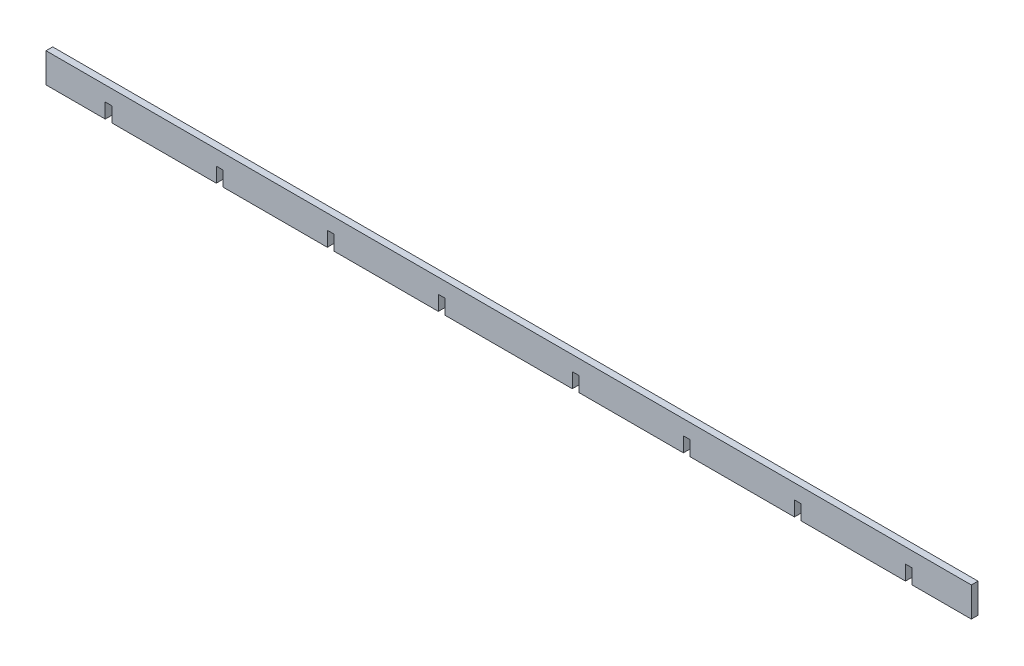
ISO-10303-21;
HEADER;
FILE_DESCRIPTION(('STEP AP214'),'2;1');
FILE_NAME('part.step','',(''),(''),'','','');
FILE_SCHEMA(('AUTOMOTIVE_DESIGN { 1 0 10303 214 1 1 1 1 }'));
ENDSEC;
DATA;
#1=APPLICATION_CONTEXT('core data for automotive mechanical design processes');
#2=APPLICATION_PROTOCOL_DEFINITION('international standard','automotive_design',2000,#1);
#3=PRODUCT_CONTEXT('',#1,'mechanical');
#4=PRODUCT('Part','Part','',(#3));
#5=PRODUCT_RELATED_PRODUCT_CATEGORY('part','',(#4));
#6=PRODUCT_DEFINITION_FORMATION('','',#4);
#7=PRODUCT_DEFINITION_CONTEXT('part definition',#1,'design');
#8=PRODUCT_DEFINITION('design','',#6,#7);
#9=PRODUCT_DEFINITION_SHAPE('','',#8);
#10=(LENGTH_UNIT() NAMED_UNIT(*) SI_UNIT(.MILLI.,.METRE.));
#11=(NAMED_UNIT(*) PLANE_ANGLE_UNIT() SI_UNIT($,.RADIAN.));
#12=(NAMED_UNIT(*) SI_UNIT($,.STERADIAN.) SOLID_ANGLE_UNIT());
#13=UNCERTAINTY_MEASURE_WITH_UNIT(LENGTH_MEASURE(1.E-05),#10,'distance_accuracy_value','');
#14=(GEOMETRIC_REPRESENTATION_CONTEXT(3) GLOBAL_UNCERTAINTY_ASSIGNED_CONTEXT((#13)) GLOBAL_UNIT_ASSIGNED_CONTEXT((#10,
#11,#12)) REPRESENTATION_CONTEXT('',''));
#15=CARTESIAN_POINT('',(0.,0.,0.));
#16=DIRECTION('',(0.,0.,1.));
#17=DIRECTION('',(1.,0.,0.));
#18=AXIS2_PLACEMENT_3D('',#15,#16,#17);
#19=CARTESIAN_POINT('',(2162.,0.,18.));
#20=DIRECTION('',(-1.,0.,0.));
#21=DIRECTION('',(0.,0.,1.));
#22=AXIS2_PLACEMENT_3D('',#19,#20,#21);
#23=PLANE('',#22);
#24=DIRECTION('',(0.,1.,0.));
#25=VECTOR('',#24,1.);
#26=CARTESIAN_POINT('',(2162.,0.,0.));
#27=LINE('',#26,#25);
#28=CARTESIAN_POINT('',(2162.,-40.,0.));
#29=VERTEX_POINT('',#28);
#30=CARTESIAN_POINT('',(2162.,0.,0.));
#31=VERTEX_POINT('',#30);
#32=EDGE_CURVE('E299',#29,#31,#27,.T.);
#33=ORIENTED_EDGE('',*,*,#32,.F.);
#34=DIRECTION('',(0.,0.,-1.));
#35=VECTOR('',#34,1.);
#36=CARTESIAN_POINT('',(2162.,-40.,18.));
#37=LINE('',#36,#35);
#38=CARTESIAN_POINT('',(2162.,-40.,18.));
#39=VERTEX_POINT('',#38);
#40=EDGE_CURVE('E11',#39,#29,#37,.T.);
#41=ORIENTED_EDGE('',*,*,#40,.F.);
#42=DIRECTION('',(0.,1.,0.));
#43=VECTOR('',#42,1.);
#44=CARTESIAN_POINT('',(2162.,0.,18.));
#45=LINE('',#44,#43);
#46=CARTESIAN_POINT('',(2162.,0.,18.));
#47=VERTEX_POINT('',#46);
#48=EDGE_CURVE('E379',#39,#47,#45,.T.);
#49=ORIENTED_EDGE('',*,*,#48,.T.);
#50=DIRECTION('',(0.,0.,-1.));
#51=VECTOR('',#50,1.);
#52=CARTESIAN_POINT('',(2162.,0.,18.));
#53=LINE('',#52,#51);
#54=EDGE_CURVE('E171',#47,#31,#53,.T.);
#55=ORIENTED_EDGE('',*,*,#54,.T.);
#56=EDGE_LOOP('',(#33,#41,#49,#55));
#57=FACE_BOUND('',#56,.T.);
#58=ADVANCED_FACE('F36',(#57),#23,.T.);
#59=CARTESIAN_POINT('',(0.,-40.,18.));
#60=DIRECTION('',(0.,1.,0.));
#61=DIRECTION('',(0.,0.,1.));
#62=AXIS2_PLACEMENT_3D('',#59,#60,#61);
#63=PLANE('',#62);
#64=DIRECTION('',(1.,0.,0.));
#65=VECTOR('',#64,1.);
#66=CARTESIAN_POINT('',(0.,-40.,0.));
#67=LINE('',#66,#65);
#68=CARTESIAN_POINT('',(2322.,-40.,0.));
#69=VERTEX_POINT('',#68);
#70=EDGE_CURVE('E302',#29,#69,#67,.T.);
#71=ORIENTED_EDGE('',*,*,#70,.T.);
#72=DIRECTION('',(0.,0.,-1.));
#73=VECTOR('',#72,1.);
#74=CARTESIAN_POINT('',(2322.,-40.,18.));
#75=LINE('',#74,#73);
#76=CARTESIAN_POINT('',(2322.,-40.,18.));
#77=VERTEX_POINT('',#76);
#78=EDGE_CURVE('E44',#77,#69,#75,.T.);
#79=ORIENTED_EDGE('',*,*,#78,.F.);
#80=DIRECTION('',(1.,0.,0.));
#81=VECTOR('',#80,1.);
#82=CARTESIAN_POINT('',(0.,-40.,18.));
#83=LINE('',#82,#81);
#84=EDGE_CURVE('E285',#39,#77,#83,.T.);
#85=ORIENTED_EDGE('',*,*,#84,.F.);
#86=ORIENTED_EDGE('',*,*,#40,.T.);
#87=EDGE_LOOP('',(#71,#79,#85,#86));
#88=FACE_BOUND('',#87,.T.);
#89=ADVANCED_FACE('F466',(#88),#63,.F.);
#90=CARTESIAN_POINT('',(2322.,0.,18.));
#91=DIRECTION('',(1.,0.,0.));
#92=DIRECTION('',(0.,0.,-1.));
#93=AXIS2_PLACEMENT_3D('',#90,#91,#92);
#94=PLANE('',#93);
#95=DIRECTION('',(0.,-1.,0.));
#96=VECTOR('',#95,1.);
#97=CARTESIAN_POINT('',(2322.,0.,0.));
#98=LINE('',#97,#96);
#99=CARTESIAN_POINT('',(2322.,40.,0.));
#100=VERTEX_POINT('',#99);
#101=EDGE_CURVE('E305',#100,#69,#98,.T.);
#102=ORIENTED_EDGE('',*,*,#101,.F.);
#103=DIRECTION('',(0.,0.,-1.));
#104=VECTOR('',#103,1.);
#105=CARTESIAN_POINT('',(2322.,40.,18.));
#106=LINE('',#105,#104);
#107=CARTESIAN_POINT('',(2322.,40.,18.));
#108=VERTEX_POINT('',#107);
#109=EDGE_CURVE('E456',#108,#100,#106,.T.);
#110=ORIENTED_EDGE('',*,*,#109,.F.);
#111=DIRECTION('',(0.,-1.,0.));
#112=VECTOR('',#111,1.);
#113=CARTESIAN_POINT('',(2322.,0.,18.));
#114=LINE('',#113,#112);
#115=EDGE_CURVE('E463',#108,#77,#114,.T.);
#116=ORIENTED_EDGE('',*,*,#115,.T.);
#117=ORIENTED_EDGE('',*,*,#78,.T.);
#118=EDGE_LOOP('',(#102,#110,#116,#117));
#119=FACE_BOUND('',#118,.T.);
#120=ADVANCED_FACE('F461',(#119),#94,.T.);
#121=CARTESIAN_POINT('',(0.,40.,18.));
#122=DIRECTION('',(0.,1.,0.));
#123=DIRECTION('',(0.,0.,1.));
#124=AXIS2_PLACEMENT_3D('',#121,#122,#123);
#125=PLANE('',#124);
#126=DIRECTION('',(1.,0.,0.));
#127=VECTOR('',#126,1.);
#128=CARTESIAN_POINT('',(0.,40.,0.));
#129=LINE('',#128,#127);
#130=CARTESIAN_POINT('',(-178.,40.,0.));
#131=VERTEX_POINT('',#130);
#132=EDGE_CURVE('E309',#131,#100,#129,.T.);
#133=ORIENTED_EDGE('',*,*,#132,.F.);
#134=DIRECTION('',(0.,0.,-1.));
#135=VECTOR('',#134,1.);
#136=CARTESIAN_POINT('',(-178.,40.,18.));
#137=LINE('',#136,#135);
#138=CARTESIAN_POINT('',(-178.,40.,18.));
#139=VERTEX_POINT('',#138);
#140=EDGE_CURVE('E454',#139,#131,#137,.T.);
#141=ORIENTED_EDGE('',*,*,#140,.F.);
#142=DIRECTION('',(1.,0.,0.));
#143=VECTOR('',#142,1.);
#144=CARTESIAN_POINT('',(0.,40.,18.));
#145=LINE('',#144,#143);
#146=EDGE_CURVE('E477',#139,#108,#145,.T.);
#147=ORIENTED_EDGE('',*,*,#146,.T.);
#148=ORIENTED_EDGE('',*,*,#109,.T.);
#149=EDGE_LOOP('',(#133,#141,#147,#148));
#150=FACE_BOUND('',#149,.T.);
#151=ADVANCED_FACE('F473',(#150),#125,.T.);
#152=CARTESIAN_POINT('',(-178.,4.94049245958195E-13,18.));
#153=DIRECTION('',(1.,0.,0.));
#154=DIRECTION('',(0.,1.,0.));
#155=AXIS2_PLACEMENT_3D('',#152,#153,#154);
#156=PLANE('',#155);
#157=DIRECTION('',(0.,-1.,0.));
#158=VECTOR('',#157,1.);
#159=CARTESIAN_POINT('',(-178.,4.94049245958195E-13,0.));
#160=LINE('',#159,#158);
#161=CARTESIAN_POINT('',(-178.,-40.,0.));
#162=VERTEX_POINT('',#161);
#163=EDGE_CURVE('E312',#131,#162,#160,.T.);
#164=ORIENTED_EDGE('',*,*,#163,.T.);
#165=DIRECTION('',(0.,0.,-1.));
#166=VECTOR('',#165,1.);
#167=CARTESIAN_POINT('',(-178.,-40.,18.));
#168=LINE('',#167,#166);
#169=CARTESIAN_POINT('',(-178.,-40.,18.));
#170=VERTEX_POINT('',#169);
#171=EDGE_CURVE('E451',#170,#162,#168,.T.);
#172=ORIENTED_EDGE('',*,*,#171,.F.);
#173=DIRECTION('',(0.,-1.,0.));
#174=VECTOR('',#173,1.);
#175=CARTESIAN_POINT('',(-178.,4.94049245958195E-13,18.));
#176=LINE('',#175,#174);
#177=EDGE_CURVE('E479',#139,#170,#176,.T.);
#178=ORIENTED_EDGE('',*,*,#177,.F.);
#179=ORIENTED_EDGE('',*,*,#140,.T.);
#180=EDGE_LOOP('',(#164,#172,#178,#179));
#181=FACE_BOUND('',#180,.T.);
#182=ADVANCED_FACE('F927',(#181),#156,.F.);
#183=CARTESIAN_POINT('',(-17.9999999999999,-40.,0.));
#184=VERTEX_POINT('',#183);
#185=EDGE_CURVE('E306',#162,#184,#67,.T.);
#186=ORIENTED_EDGE('',*,*,#185,.T.);
#187=DIRECTION('',(0.,0.,-1.));
#188=VECTOR('',#187,1.);
#189=CARTESIAN_POINT('',(-17.9999999999999,-40.,18.));
#190=LINE('',#189,#188);
#191=CARTESIAN_POINT('',(-17.9999999999999,-40.,18.));
#192=VERTEX_POINT('',#191);
#193=EDGE_CURVE('E448',#192,#184,#190,.T.);
#194=ORIENTED_EDGE('',*,*,#193,.F.);
#195=EDGE_CURVE('E481',#170,#192,#83,.T.);
#196=ORIENTED_EDGE('',*,*,#195,.F.);
#197=ORIENTED_EDGE('',*,*,#171,.T.);
#198=EDGE_LOOP('',(#186,#194,#196,#197));
#199=FACE_BOUND('',#198,.T.);
#200=ADVANCED_FACE('F561',(#199),#63,.F.);
#201=CARTESIAN_POINT('',(-17.9999999999999,0.,18.));
#202=DIRECTION('',(-1.,0.,0.));
#203=DIRECTION('',(0.,0.,1.));
#204=AXIS2_PLACEMENT_3D('',#201,#202,#203);
#205=PLANE('',#204);
#206=DIRECTION('',(0.,1.,0.));
#207=VECTOR('',#206,1.);
#208=CARTESIAN_POINT('',(-17.9999999999999,0.,0.));
#209=LINE('',#208,#207);
#210=CARTESIAN_POINT('',(-17.9999999999999,0.,0.));
#211=VERTEX_POINT('',#210);
#212=EDGE_CURVE('E314',#184,#211,#209,.T.);
#213=ORIENTED_EDGE('',*,*,#212,.T.);
#214=DIRECTION('',(0.,0.,-1.));
#215=VECTOR('',#214,1.);
#216=CARTESIAN_POINT('',(-17.9999999999999,0.,18.));
#217=LINE('',#216,#215);
#218=CARTESIAN_POINT('',(-17.9999999999999,0.,18.));
#219=VERTEX_POINT('',#218);
#220=EDGE_CURVE('E445',#219,#211,#217,.T.);
#221=ORIENTED_EDGE('',*,*,#220,.F.);
#222=DIRECTION('',(0.,1.,0.));
#223=VECTOR('',#222,1.);
#224=CARTESIAN_POINT('',(-17.9999999999999,0.,18.));
#225=LINE('',#224,#223);
#226=EDGE_CURVE('E485',#192,#219,#225,.T.);
#227=ORIENTED_EDGE('',*,*,#226,.F.);
#228=ORIENTED_EDGE('',*,*,#193,.T.);
#229=EDGE_LOOP('',(#213,#221,#227,#228));
#230=FACE_BOUND('',#229,.T.);
#231=ADVANCED_FACE('F567',(#230),#205,.F.);
#232=CARTESIAN_POINT('',(0.,0.,18.));
#233=DIRECTION('',(0.,1.,0.));
#234=DIRECTION('',(0.,0.,1.));
#235=AXIS2_PLACEMENT_3D('',#232,#233,#234);
#236=PLANE('',#235);
#237=DIRECTION('',(1.,0.,0.));
#238=VECTOR('',#237,1.);
#239=CARTESIAN_POINT('',(0.,0.,0.));
#240=LINE('',#239,#238);
#241=CARTESIAN_POINT('',(0.,0.,0.));
#242=VERTEX_POINT('',#241);
#243=EDGE_CURVE('E316',#211,#242,#240,.T.);
#244=ORIENTED_EDGE('',*,*,#243,.T.);
#245=DIRECTION('',(0.,0.,-1.));
#246=VECTOR('',#245,1.);
#247=CARTESIAN_POINT('',(0.,0.,18.));
#248=LINE('',#247,#246);
#249=CARTESIAN_POINT('',(0.,0.,18.));
#250=VERTEX_POINT('',#249);
#251=EDGE_CURVE('E443',#250,#242,#248,.T.);
#252=ORIENTED_EDGE('',*,*,#251,.F.);
#253=DIRECTION('',(1.,0.,0.));
#254=VECTOR('',#253,1.);
#255=CARTESIAN_POINT('',(0.,0.,18.));
#256=LINE('',#255,#254);
#257=EDGE_CURVE('E487',#219,#250,#256,.T.);
#258=ORIENTED_EDGE('',*,*,#257,.F.);
#259=ORIENTED_EDGE('',*,*,#220,.T.);
#260=EDGE_LOOP('',(#244,#252,#258,#259));
#261=FACE_BOUND('',#260,.T.);
#262=ADVANCED_FACE('F573',(#261),#236,.F.);
#263=CARTESIAN_POINT('',(0.,0.,18.));
#264=DIRECTION('',(-1.,0.,0.));
#265=DIRECTION('',(0.,0.,1.));
#266=AXIS2_PLACEMENT_3D('',#263,#264,#265);
#267=PLANE('',#266);
#268=DIRECTION('',(0.,1.,0.));
#269=VECTOR('',#268,1.);
#270=CARTESIAN_POINT('',(0.,0.,0.));
#271=LINE('',#270,#269);
#272=CARTESIAN_POINT('',(0.,-40.,0.));
#273=VERTEX_POINT('',#272);
#274=EDGE_CURVE('E319',#273,#242,#271,.T.);
#275=ORIENTED_EDGE('',*,*,#274,.F.);
#276=DIRECTION('',(0.,0.,-1.));
#277=VECTOR('',#276,1.);
#278=CARTESIAN_POINT('',(0.,-40.,18.));
#279=LINE('',#278,#277);
#280=CARTESIAN_POINT('',(0.,-40.,18.));
#281=VERTEX_POINT('',#280);
#282=EDGE_CURVE('E441',#281,#273,#279,.T.);
#283=ORIENTED_EDGE('',*,*,#282,.F.);
#284=DIRECTION('',(0.,1.,0.));
#285=VECTOR('',#284,1.);
#286=CARTESIAN_POINT('',(0.,0.,18.));
#287=LINE('',#286,#285);
#288=EDGE_CURVE('E489',#281,#250,#287,.T.);
#289=ORIENTED_EDGE('',*,*,#288,.T.);
#290=ORIENTED_EDGE('',*,*,#251,.T.);
#291=EDGE_LOOP('',(#275,#283,#289,#290));
#292=FACE_BOUND('',#291,.T.);
#293=ADVANCED_FACE('F666',(#292),#267,.T.);
#294=CARTESIAN_POINT('',(282.,-40.,0.));
#295=VERTEX_POINT('',#294);
#296=EDGE_CURVE('E322',#273,#295,#67,.T.);
#297=ORIENTED_EDGE('',*,*,#296,.T.);
#298=DIRECTION('',(0.,0.,-1.));
#299=VECTOR('',#298,1.);
#300=CARTESIAN_POINT('',(282.,-40.,18.));
#301=LINE('',#300,#299);
#302=CARTESIAN_POINT('',(282.,-40.,18.));
#303=VERTEX_POINT('',#302);
#304=EDGE_CURVE('E438',#303,#295,#301,.T.);
#305=ORIENTED_EDGE('',*,*,#304,.F.);
#306=EDGE_CURVE('E492',#281,#303,#83,.T.);
#307=ORIENTED_EDGE('',*,*,#306,.F.);
#308=ORIENTED_EDGE('',*,*,#282,.T.);
#309=EDGE_LOOP('',(#297,#305,#307,#308));
#310=FACE_BOUND('',#309,.T.);
#311=ADVANCED_FACE('F664',(#310),#63,.F.);
#312=CARTESIAN_POINT('',(282.,0.,18.));
#313=DIRECTION('',(-1.,0.,0.));
#314=DIRECTION('',(0.,0.,1.));
#315=AXIS2_PLACEMENT_3D('',#312,#313,#314);
#316=PLANE('',#315);
#317=DIRECTION('',(0.,1.,0.));
#318=VECTOR('',#317,1.);
#319=CARTESIAN_POINT('',(282.,0.,0.));
#320=LINE('',#319,#318);
#321=CARTESIAN_POINT('',(282.,0.,0.));
#322=VERTEX_POINT('',#321);
#323=EDGE_CURVE('E323',#295,#322,#320,.T.);
#324=ORIENTED_EDGE('',*,*,#323,.T.);
#325=DIRECTION('',(0.,0.,-1.));
#326=VECTOR('',#325,1.);
#327=CARTESIAN_POINT('',(282.,0.,18.));
#328=LINE('',#327,#326);
#329=CARTESIAN_POINT('',(282.,0.,18.));
#330=VERTEX_POINT('',#329);
#331=EDGE_CURVE('E435',#330,#322,#328,.T.);
#332=ORIENTED_EDGE('',*,*,#331,.F.);
#333=DIRECTION('',(0.,1.,0.));
#334=VECTOR('',#333,1.);
#335=CARTESIAN_POINT('',(282.,0.,18.));
#336=LINE('',#335,#334);
#337=EDGE_CURVE('E493',#303,#330,#336,.T.);
#338=ORIENTED_EDGE('',*,*,#337,.F.);
#339=ORIENTED_EDGE('',*,*,#304,.T.);
#340=EDGE_LOOP('',(#324,#332,#338,#339));
#341=FACE_BOUND('',#340,.T.);
#342=ADVANCED_FACE('F663',(#341),#316,.F.);
#343=CARTESIAN_POINT('',(0.,0.,18.));
#344=DIRECTION('',(0.,1.,0.));
#345=DIRECTION('',(0.,0.,1.));
#346=AXIS2_PLACEMENT_3D('',#343,#344,#345);
#347=PLANE('',#346);
#348=DIRECTION('',(1.,0.,0.));
#349=VECTOR('',#348,1.);
#350=CARTESIAN_POINT('',(0.,0.,0.));
#351=LINE('',#350,#349);
#352=CARTESIAN_POINT('',(300.,0.,0.));
#353=VERTEX_POINT('',#352);
#354=EDGE_CURVE('E325',#322,#353,#351,.T.);
#355=ORIENTED_EDGE('',*,*,#354,.T.);
#356=DIRECTION('',(0.,0.,-1.));
#357=VECTOR('',#356,1.);
#358=CARTESIAN_POINT('',(300.,0.,18.));
#359=LINE('',#358,#357);
#360=CARTESIAN_POINT('',(300.,0.,18.));
#361=VERTEX_POINT('',#360);
#362=EDGE_CURVE('E433',#361,#353,#359,.T.);
#363=ORIENTED_EDGE('',*,*,#362,.F.);
#364=DIRECTION('',(1.,0.,0.));
#365=VECTOR('',#364,1.);
#366=CARTESIAN_POINT('',(0.,0.,18.));
#367=LINE('',#366,#365);
#368=EDGE_CURVE('E495',#330,#361,#367,.T.);
#369=ORIENTED_EDGE('',*,*,#368,.F.);
#370=ORIENTED_EDGE('',*,*,#331,.T.);
#371=EDGE_LOOP('',(#355,#363,#369,#370));
#372=FACE_BOUND('',#371,.T.);
#373=ADVANCED_FACE('F659',(#372),#347,.F.);
#374=CARTESIAN_POINT('',(300.,0.,18.));
#375=DIRECTION('',(-1.,0.,0.));
#376=DIRECTION('',(0.,0.,1.));
#377=AXIS2_PLACEMENT_3D('',#374,#375,#376);
#378=PLANE('',#377);
#379=DIRECTION('',(0.,1.,0.));
#380=VECTOR('',#379,1.);
#381=CARTESIAN_POINT('',(300.,0.,0.));
#382=LINE('',#381,#380);
#383=CARTESIAN_POINT('',(300.,-40.,0.));
#384=VERTEX_POINT('',#383);
#385=EDGE_CURVE('E328',#384,#353,#382,.T.);
#386=ORIENTED_EDGE('',*,*,#385,.F.);
#387=DIRECTION('',(0.,0.,-1.));
#388=VECTOR('',#387,1.);
#389=CARTESIAN_POINT('',(300.,-40.,18.));
#390=LINE('',#389,#388);
#391=CARTESIAN_POINT('',(300.,-40.,18.));
#392=VERTEX_POINT('',#391);
#393=EDGE_CURVE('E431',#392,#384,#390,.T.);
#394=ORIENTED_EDGE('',*,*,#393,.F.);
#395=DIRECTION('',(0.,1.,0.));
#396=VECTOR('',#395,1.);
#397=CARTESIAN_POINT('',(300.,0.,18.));
#398=LINE('',#397,#396);
#399=EDGE_CURVE('E497',#392,#361,#398,.T.);
#400=ORIENTED_EDGE('',*,*,#399,.T.);
#401=ORIENTED_EDGE('',*,*,#362,.T.);
#402=EDGE_LOOP('',(#386,#394,#400,#401));
#403=FACE_BOUND('',#402,.T.);
#404=ADVANCED_FACE('F655',(#403),#378,.T.);
#405=CARTESIAN_POINT('',(582.,-40.,0.));
#406=VERTEX_POINT('',#405);
#407=EDGE_CURVE('E331',#384,#406,#67,.T.);
#408=ORIENTED_EDGE('',*,*,#407,.T.);
#409=DIRECTION('',(0.,0.,-1.));
#410=VECTOR('',#409,1.);
#411=CARTESIAN_POINT('',(582.,-40.,18.));
#412=LINE('',#411,#410);
#413=CARTESIAN_POINT('',(582.,-40.,18.));
#414=VERTEX_POINT('',#413);
#415=EDGE_CURVE('E428',#414,#406,#412,.T.);
#416=ORIENTED_EDGE('',*,*,#415,.F.);
#417=EDGE_CURVE('E500',#392,#414,#83,.T.);
#418=ORIENTED_EDGE('',*,*,#417,.F.);
#419=ORIENTED_EDGE('',*,*,#393,.T.);
#420=EDGE_LOOP('',(#408,#416,#418,#419));
#421=FACE_BOUND('',#420,.T.);
#422=ADVANCED_FACE('F650',(#421),#63,.F.);
#423=CARTESIAN_POINT('',(582.,0.,18.));
#424=DIRECTION('',(-1.,0.,0.));
#425=DIRECTION('',(0.,0.,1.));
#426=AXIS2_PLACEMENT_3D('',#423,#424,#425);
#427=PLANE('',#426);
#428=DIRECTION('',(0.,1.,0.));
#429=VECTOR('',#428,1.);
#430=CARTESIAN_POINT('',(582.,0.,0.));
#431=LINE('',#430,#429);
#432=CARTESIAN_POINT('',(582.,0.,0.));
#433=VERTEX_POINT('',#432);
#434=EDGE_CURVE('E332',#406,#433,#431,.T.);
#435=ORIENTED_EDGE('',*,*,#434,.T.);
#436=DIRECTION('',(0.,0.,-1.));
#437=VECTOR('',#436,1.);
#438=CARTESIAN_POINT('',(582.,0.,18.));
#439=LINE('',#438,#437);
#440=CARTESIAN_POINT('',(582.,0.,18.));
#441=VERTEX_POINT('',#440);
#442=EDGE_CURVE('E425',#441,#433,#439,.T.);
#443=ORIENTED_EDGE('',*,*,#442,.F.);
#444=DIRECTION('',(0.,1.,0.));
#445=VECTOR('',#444,1.);
#446=CARTESIAN_POINT('',(582.,0.,18.));
#447=LINE('',#446,#445);
#448=EDGE_CURVE('E501',#414,#441,#447,.T.);
#449=ORIENTED_EDGE('',*,*,#448,.F.);
#450=ORIENTED_EDGE('',*,*,#415,.T.);
#451=EDGE_LOOP('',(#435,#443,#449,#450));
#452=FACE_BOUND('',#451,.T.);
#453=ADVANCED_FACE('F649',(#452),#427,.F.);
#454=CARTESIAN_POINT('',(0.,0.,18.));
#455=DIRECTION('',(0.,1.,0.));
#456=DIRECTION('',(0.,0.,1.));
#457=AXIS2_PLACEMENT_3D('',#454,#455,#456);
#458=PLANE('',#457);
#459=DIRECTION('',(1.,0.,0.));
#460=VECTOR('',#459,1.);
#461=CARTESIAN_POINT('',(0.,0.,0.));
#462=LINE('',#461,#460);
#463=CARTESIAN_POINT('',(600.,0.,0.));
#464=VERTEX_POINT('',#463);
#465=EDGE_CURVE('E334',#433,#464,#462,.T.);
#466=ORIENTED_EDGE('',*,*,#465,.T.);
#467=DIRECTION('',(0.,0.,-1.));
#468=VECTOR('',#467,1.);
#469=CARTESIAN_POINT('',(600.,0.,18.));
#470=LINE('',#469,#468);
#471=CARTESIAN_POINT('',(600.,0.,18.));
#472=VERTEX_POINT('',#471);
#473=EDGE_CURVE('E423',#472,#464,#470,.T.);
#474=ORIENTED_EDGE('',*,*,#473,.F.);
#475=DIRECTION('',(1.,0.,0.));
#476=VECTOR('',#475,1.);
#477=CARTESIAN_POINT('',(0.,0.,18.));
#478=LINE('',#477,#476);
#479=EDGE_CURVE('E503',#441,#472,#478,.T.);
#480=ORIENTED_EDGE('',*,*,#479,.F.);
#481=ORIENTED_EDGE('',*,*,#442,.T.);
#482=EDGE_LOOP('',(#466,#474,#480,#481));
#483=FACE_BOUND('',#482,.T.);
#484=ADVANCED_FACE('F645',(#483),#458,.F.);
#485=CARTESIAN_POINT('',(600.,0.,18.));
#486=DIRECTION('',(-1.,0.,0.));
#487=DIRECTION('',(0.,0.,1.));
#488=AXIS2_PLACEMENT_3D('',#485,#486,#487);
#489=PLANE('',#488);
#490=DIRECTION('',(0.,1.,0.));
#491=VECTOR('',#490,1.);
#492=CARTESIAN_POINT('',(600.,0.,0.));
#493=LINE('',#492,#491);
#494=CARTESIAN_POINT('',(600.,-40.,0.));
#495=VERTEX_POINT('',#494);
#496=EDGE_CURVE('E337',#495,#464,#493,.T.);
#497=ORIENTED_EDGE('',*,*,#496,.F.);
#498=DIRECTION('',(0.,0.,-1.));
#499=VECTOR('',#498,1.);
#500=CARTESIAN_POINT('',(600.,-40.,18.));
#501=LINE('',#500,#499);
#502=CARTESIAN_POINT('',(600.,-40.,18.));
#503=VERTEX_POINT('',#502);
#504=EDGE_CURVE('E421',#503,#495,#501,.T.);
#505=ORIENTED_EDGE('',*,*,#504,.F.);
#506=DIRECTION('',(0.,1.,0.));
#507=VECTOR('',#506,1.);
#508=CARTESIAN_POINT('',(600.,0.,18.));
#509=LINE('',#508,#507);
#510=EDGE_CURVE('E505',#503,#472,#509,.T.);
#511=ORIENTED_EDGE('',*,*,#510,.T.);
#512=ORIENTED_EDGE('',*,*,#473,.T.);
#513=EDGE_LOOP('',(#497,#505,#511,#512));
#514=FACE_BOUND('',#513,.T.);
#515=ADVANCED_FACE('F641',(#514),#489,.T.);
#516=CARTESIAN_POINT('',(882.,-40.,0.));
#517=VERTEX_POINT('',#516);
#518=EDGE_CURVE('E340',#495,#517,#67,.T.);
#519=ORIENTED_EDGE('',*,*,#518,.T.);
#520=DIRECTION('',(0.,0.,-1.));
#521=VECTOR('',#520,1.);
#522=CARTESIAN_POINT('',(882.,-40.,18.));
#523=LINE('',#522,#521);
#524=CARTESIAN_POINT('',(882.,-40.,18.));
#525=VERTEX_POINT('',#524);
#526=EDGE_CURVE('E418',#525,#517,#523,.T.);
#527=ORIENTED_EDGE('',*,*,#526,.F.);
#528=EDGE_CURVE('E508',#503,#525,#83,.T.);
#529=ORIENTED_EDGE('',*,*,#528,.F.);
#530=ORIENTED_EDGE('',*,*,#504,.T.);
#531=EDGE_LOOP('',(#519,#527,#529,#530));
#532=FACE_BOUND('',#531,.T.);
#533=ADVANCED_FACE('F636',(#532),#63,.F.);
#534=CARTESIAN_POINT('',(882.,0.,18.));
#535=DIRECTION('',(-1.,0.,0.));
#536=DIRECTION('',(0.,0.,1.));
#537=AXIS2_PLACEMENT_3D('',#534,#535,#536);
#538=PLANE('',#537);
#539=DIRECTION('',(0.,1.,0.));
#540=VECTOR('',#539,1.);
#541=CARTESIAN_POINT('',(882.,0.,0.));
#542=LINE('',#541,#540);
#543=CARTESIAN_POINT('',(882.,0.,0.));
#544=VERTEX_POINT('',#543);
#545=EDGE_CURVE('E341',#517,#544,#542,.T.);
#546=ORIENTED_EDGE('',*,*,#545,.T.);
#547=DIRECTION('',(0.,0.,-1.));
#548=VECTOR('',#547,1.);
#549=CARTESIAN_POINT('',(882.,0.,18.));
#550=LINE('',#549,#548);
#551=CARTESIAN_POINT('',(882.,0.,18.));
#552=VERTEX_POINT('',#551);
#553=EDGE_CURVE('E415',#552,#544,#550,.T.);
#554=ORIENTED_EDGE('',*,*,#553,.F.);
#555=DIRECTION('',(0.,1.,0.));
#556=VECTOR('',#555,1.);
#557=CARTESIAN_POINT('',(882.,0.,18.));
#558=LINE('',#557,#556);
#559=EDGE_CURVE('E509',#525,#552,#558,.T.);
#560=ORIENTED_EDGE('',*,*,#559,.F.);
#561=ORIENTED_EDGE('',*,*,#526,.T.);
#562=EDGE_LOOP('',(#546,#554,#560,#561));
#563=FACE_BOUND('',#562,.T.);
#564=ADVANCED_FACE('F635',(#563),#538,.F.);
#565=CARTESIAN_POINT('',(0.,0.,18.));
#566=DIRECTION('',(0.,1.,0.));
#567=DIRECTION('',(0.,0.,1.));
#568=AXIS2_PLACEMENT_3D('',#565,#566,#567);
#569=PLANE('',#568);
#570=DIRECTION('',(1.,0.,0.));
#571=VECTOR('',#570,1.);
#572=CARTESIAN_POINT('',(0.,0.,0.));
#573=LINE('',#572,#571);
#574=CARTESIAN_POINT('',(900.,0.,0.));
#575=VERTEX_POINT('',#574);
#576=EDGE_CURVE('E343',#544,#575,#573,.T.);
#577=ORIENTED_EDGE('',*,*,#576,.T.);
#578=DIRECTION('',(0.,0.,-1.));
#579=VECTOR('',#578,1.);
#580=CARTESIAN_POINT('',(900.,0.,18.));
#581=LINE('',#580,#579);
#582=CARTESIAN_POINT('',(900.,0.,18.));
#583=VERTEX_POINT('',#582);
#584=EDGE_CURVE('E413',#583,#575,#581,.T.);
#585=ORIENTED_EDGE('',*,*,#584,.F.);
#586=DIRECTION('',(1.,0.,0.));
#587=VECTOR('',#586,1.);
#588=CARTESIAN_POINT('',(0.,0.,18.));
#589=LINE('',#588,#587);
#590=EDGE_CURVE('E511',#552,#583,#589,.T.);
#591=ORIENTED_EDGE('',*,*,#590,.F.);
#592=ORIENTED_EDGE('',*,*,#553,.T.);
#593=EDGE_LOOP('',(#577,#585,#591,#592));
#594=FACE_BOUND('',#593,.T.);
#595=ADVANCED_FACE('F631',(#594),#569,.F.);
#596=CARTESIAN_POINT('',(900.,0.,18.));
#597=DIRECTION('',(-1.,0.,0.));
#598=DIRECTION('',(0.,0.,1.));
#599=AXIS2_PLACEMENT_3D('',#596,#597,#598);
#600=PLANE('',#599);
#601=DIRECTION('',(0.,1.,0.));
#602=VECTOR('',#601,1.);
#603=CARTESIAN_POINT('',(900.,0.,0.));
#604=LINE('',#603,#602);
#605=CARTESIAN_POINT('',(900.,-40.,0.));
#606=VERTEX_POINT('',#605);
#607=EDGE_CURVE('E346',#606,#575,#604,.T.);
#608=ORIENTED_EDGE('',*,*,#607,.F.);
#609=DIRECTION('',(0.,0.,-1.));
#610=VECTOR('',#609,1.);
#611=CARTESIAN_POINT('',(900.,-40.,18.));
#612=LINE('',#611,#610);
#613=CARTESIAN_POINT('',(900.,-40.,18.));
#614=VERTEX_POINT('',#613);
#615=EDGE_CURVE('E411',#614,#606,#612,.T.);
#616=ORIENTED_EDGE('',*,*,#615,.F.);
#617=DIRECTION('',(0.,1.,0.));
#618=VECTOR('',#617,1.);
#619=CARTESIAN_POINT('',(900.,0.,18.));
#620=LINE('',#619,#618);
#621=EDGE_CURVE('E513',#614,#583,#620,.T.);
#622=ORIENTED_EDGE('',*,*,#621,.T.);
#623=ORIENTED_EDGE('',*,*,#584,.T.);
#624=EDGE_LOOP('',(#608,#616,#622,#623));
#625=FACE_BOUND('',#624,.T.);
#626=ADVANCED_FACE('F627',(#625),#600,.T.);
#627=CARTESIAN_POINT('',(1244.,-40.,0.));
#628=VERTEX_POINT('',#627);
#629=EDGE_CURVE('E349',#606,#628,#67,.T.);
#630=ORIENTED_EDGE('',*,*,#629,.T.);
#631=DIRECTION('',(0.,0.,-1.));
#632=VECTOR('',#631,1.);
#633=CARTESIAN_POINT('',(1244.,-40.,18.));
#634=LINE('',#633,#632);
#635=CARTESIAN_POINT('',(1244.,-40.,18.));
#636=VERTEX_POINT('',#635);
#637=EDGE_CURVE('E408',#636,#628,#634,.T.);
#638=ORIENTED_EDGE('',*,*,#637,.F.);
#639=EDGE_CURVE('E516',#614,#636,#83,.T.);
#640=ORIENTED_EDGE('',*,*,#639,.F.);
#641=ORIENTED_EDGE('',*,*,#615,.T.);
#642=EDGE_LOOP('',(#630,#638,#640,#641));
#643=FACE_BOUND('',#642,.T.);
#644=ADVANCED_FACE('F622',(#643),#63,.F.);
#645=CARTESIAN_POINT('',(1244.,0.,18.));
#646=DIRECTION('',(-1.,0.,0.));
#647=DIRECTION('',(0.,0.,1.));
#648=AXIS2_PLACEMENT_3D('',#645,#646,#647);
#649=PLANE('',#648);
#650=DIRECTION('',(0.,1.,0.));
#651=VECTOR('',#650,1.);
#652=CARTESIAN_POINT('',(1244.,0.,0.));
#653=LINE('',#652,#651);
#654=CARTESIAN_POINT('',(1244.,0.,0.));
#655=VERTEX_POINT('',#654);
#656=EDGE_CURVE('E350',#628,#655,#653,.T.);
#657=ORIENTED_EDGE('',*,*,#656,.T.);
#658=DIRECTION('',(0.,0.,-1.));
#659=VECTOR('',#658,1.);
#660=CARTESIAN_POINT('',(1244.,0.,18.));
#661=LINE('',#660,#659);
#662=CARTESIAN_POINT('',(1244.,0.,18.));
#663=VERTEX_POINT('',#662);
#664=EDGE_CURVE('E405',#663,#655,#661,.T.);
#665=ORIENTED_EDGE('',*,*,#664,.F.);
#666=DIRECTION('',(0.,1.,0.));
#667=VECTOR('',#666,1.);
#668=CARTESIAN_POINT('',(1244.,0.,18.));
#669=LINE('',#668,#667);
#670=EDGE_CURVE('E517',#636,#663,#669,.T.);
#671=ORIENTED_EDGE('',*,*,#670,.F.);
#672=ORIENTED_EDGE('',*,*,#637,.T.);
#673=EDGE_LOOP('',(#657,#665,#671,#672));
#674=FACE_BOUND('',#673,.T.);
#675=ADVANCED_FACE('F621',(#674),#649,.F.);
#676=CARTESIAN_POINT('',(0.,0.,18.));
#677=DIRECTION('',(0.,1.,0.));
#678=DIRECTION('',(0.,0.,1.));
#679=AXIS2_PLACEMENT_3D('',#676,#677,#678);
#680=PLANE('',#679);
#681=DIRECTION('',(1.,0.,0.));
#682=VECTOR('',#681,1.);
#683=CARTESIAN_POINT('',(0.,0.,0.));
#684=LINE('',#683,#682);
#685=CARTESIAN_POINT('',(1262.,0.,0.));
#686=VERTEX_POINT('',#685);
#687=EDGE_CURVE('E352',#655,#686,#684,.T.);
#688=ORIENTED_EDGE('',*,*,#687,.T.);
#689=DIRECTION('',(0.,0.,-1.));
#690=VECTOR('',#689,1.);
#691=CARTESIAN_POINT('',(1262.,0.,18.));
#692=LINE('',#691,#690);
#693=CARTESIAN_POINT('',(1262.,0.,18.));
#694=VERTEX_POINT('',#693);
#695=EDGE_CURVE('E403',#694,#686,#692,.T.);
#696=ORIENTED_EDGE('',*,*,#695,.F.);
#697=DIRECTION('',(1.,0.,0.));
#698=VECTOR('',#697,1.);
#699=CARTESIAN_POINT('',(0.,0.,18.));
#700=LINE('',#699,#698);
#701=EDGE_CURVE('E519',#663,#694,#700,.T.);
#702=ORIENTED_EDGE('',*,*,#701,.F.);
#703=ORIENTED_EDGE('',*,*,#664,.T.);
#704=EDGE_LOOP('',(#688,#696,#702,#703));
#705=FACE_BOUND('',#704,.T.);
#706=ADVANCED_FACE('F617',(#705),#680,.F.);
#707=CARTESIAN_POINT('',(1262.,0.,18.));
#708=DIRECTION('',(-1.,0.,0.));
#709=DIRECTION('',(0.,0.,1.));
#710=AXIS2_PLACEMENT_3D('',#707,#708,#709);
#711=PLANE('',#710);
#712=DIRECTION('',(0.,1.,0.));
#713=VECTOR('',#712,1.);
#714=CARTESIAN_POINT('',(1262.,0.,0.));
#715=LINE('',#714,#713);
#716=CARTESIAN_POINT('',(1262.,-40.,0.));
#717=VERTEX_POINT('',#716);
#718=EDGE_CURVE('E355',#717,#686,#715,.T.);
#719=ORIENTED_EDGE('',*,*,#718,.F.);
#720=DIRECTION('',(0.,0.,-1.));
#721=VECTOR('',#720,1.);
#722=CARTESIAN_POINT('',(1262.,-40.,18.));
#723=LINE('',#722,#721);
#724=CARTESIAN_POINT('',(1262.,-40.,18.));
#725=VERTEX_POINT('',#724);
#726=EDGE_CURVE('E401',#725,#717,#723,.T.);
#727=ORIENTED_EDGE('',*,*,#726,.F.);
#728=DIRECTION('',(0.,1.,0.));
#729=VECTOR('',#728,1.);
#730=CARTESIAN_POINT('',(1262.,0.,18.));
#731=LINE('',#730,#729);
#732=EDGE_CURVE('E521',#725,#694,#731,.T.);
#733=ORIENTED_EDGE('',*,*,#732,.T.);
#734=ORIENTED_EDGE('',*,*,#695,.T.);
#735=EDGE_LOOP('',(#719,#727,#733,#734));
#736=FACE_BOUND('',#735,.T.);
#737=ADVANCED_FACE('F613',(#736),#711,.T.);
#738=CARTESIAN_POINT('',(1544.,-40.,0.));
#739=VERTEX_POINT('',#738);
#740=EDGE_CURVE('E358',#717,#739,#67,.T.);
#741=ORIENTED_EDGE('',*,*,#740,.T.);
#742=DIRECTION('',(0.,0.,-1.));
#743=VECTOR('',#742,1.);
#744=CARTESIAN_POINT('',(1544.,-40.,18.));
#745=LINE('',#744,#743);
#746=CARTESIAN_POINT('',(1544.,-40.,18.));
#747=VERTEX_POINT('',#746);
#748=EDGE_CURVE('E398',#747,#739,#745,.T.);
#749=ORIENTED_EDGE('',*,*,#748,.F.);
#750=EDGE_CURVE('E524',#725,#747,#83,.T.);
#751=ORIENTED_EDGE('',*,*,#750,.F.);
#752=ORIENTED_EDGE('',*,*,#726,.T.);
#753=EDGE_LOOP('',(#741,#749,#751,#752));
#754=FACE_BOUND('',#753,.T.);
#755=ADVANCED_FACE('F609',(#754),#63,.F.);
#756=CARTESIAN_POINT('',(1544.,0.,18.));
#757=DIRECTION('',(-1.,0.,0.));
#758=DIRECTION('',(0.,0.,1.));
#759=AXIS2_PLACEMENT_3D('',#756,#757,#758);
#760=PLANE('',#759);
#761=DIRECTION('',(0.,1.,0.));
#762=VECTOR('',#761,1.);
#763=CARTESIAN_POINT('',(1544.,0.,0.));
#764=LINE('',#763,#762);
#765=CARTESIAN_POINT('',(1544.,0.,0.));
#766=VERTEX_POINT('',#765);
#767=EDGE_CURVE('E359',#739,#766,#764,.T.);
#768=ORIENTED_EDGE('',*,*,#767,.T.);
#769=DIRECTION('',(0.,0.,-1.));
#770=VECTOR('',#769,1.);
#771=CARTESIAN_POINT('',(1544.,0.,18.));
#772=LINE('',#771,#770);
#773=CARTESIAN_POINT('',(1544.,0.,18.));
#774=VERTEX_POINT('',#773);
#775=EDGE_CURVE('E395',#774,#766,#772,.T.);
#776=ORIENTED_EDGE('',*,*,#775,.F.);
#777=DIRECTION('',(0.,1.,0.));
#778=VECTOR('',#777,1.);
#779=CARTESIAN_POINT('',(1544.,0.,18.));
#780=LINE('',#779,#778);
#781=EDGE_CURVE('E525',#747,#774,#780,.T.);
#782=ORIENTED_EDGE('',*,*,#781,.F.);
#783=ORIENTED_EDGE('',*,*,#748,.T.);
#784=EDGE_LOOP('',(#768,#776,#782,#783));
#785=FACE_BOUND('',#784,.T.);
#786=ADVANCED_FACE('F607',(#785),#760,.F.);
#787=CARTESIAN_POINT('',(0.,0.,18.));
#788=DIRECTION('',(0.,1.,0.));
#789=DIRECTION('',(0.,0.,1.));
#790=AXIS2_PLACEMENT_3D('',#787,#788,#789);
#791=PLANE('',#790);
#792=DIRECTION('',(1.,0.,0.));
#793=VECTOR('',#792,1.);
#794=CARTESIAN_POINT('',(0.,0.,0.));
#795=LINE('',#794,#793);
#796=CARTESIAN_POINT('',(1562.,0.,0.));
#797=VERTEX_POINT('',#796);
#798=EDGE_CURVE('E361',#766,#797,#795,.T.);
#799=ORIENTED_EDGE('',*,*,#798,.T.);
#800=DIRECTION('',(0.,0.,-1.));
#801=VECTOR('',#800,1.);
#802=CARTESIAN_POINT('',(1562.,0.,18.));
#803=LINE('',#802,#801);
#804=CARTESIAN_POINT('',(1562.,0.,18.));
#805=VERTEX_POINT('',#804);
#806=EDGE_CURVE('E393',#805,#797,#803,.T.);
#807=ORIENTED_EDGE('',*,*,#806,.F.);
#808=DIRECTION('',(1.,0.,0.));
#809=VECTOR('',#808,1.);
#810=CARTESIAN_POINT('',(0.,0.,18.));
#811=LINE('',#810,#809);
#812=EDGE_CURVE('E527',#774,#805,#811,.T.);
#813=ORIENTED_EDGE('',*,*,#812,.F.);
#814=ORIENTED_EDGE('',*,*,#775,.T.);
#815=EDGE_LOOP('',(#799,#807,#813,#814));
#816=FACE_BOUND('',#815,.T.);
#817=ADVANCED_FACE('F602',(#816),#791,.F.);
#818=CARTESIAN_POINT('',(1562.,0.,18.));
#819=DIRECTION('',(-1.,0.,0.));
#820=DIRECTION('',(0.,0.,1.));
#821=AXIS2_PLACEMENT_3D('',#818,#819,#820);
#822=PLANE('',#821);
#823=DIRECTION('',(0.,1.,0.));
#824=VECTOR('',#823,1.);
#825=CARTESIAN_POINT('',(1562.,0.,0.));
#826=LINE('',#825,#824);
#827=CARTESIAN_POINT('',(1562.,-40.,0.));
#828=VERTEX_POINT('',#827);
#829=EDGE_CURVE('E364',#828,#797,#826,.T.);
#830=ORIENTED_EDGE('',*,*,#829,.F.);
#831=DIRECTION('',(0.,0.,-1.));
#832=VECTOR('',#831,1.);
#833=CARTESIAN_POINT('',(1562.,-40.,18.));
#834=LINE('',#833,#832);
#835=CARTESIAN_POINT('',(1562.,-40.,18.));
#836=VERTEX_POINT('',#835);
#837=EDGE_CURVE('E391',#836,#828,#834,.T.);
#838=ORIENTED_EDGE('',*,*,#837,.F.);
#839=DIRECTION('',(0.,1.,0.));
#840=VECTOR('',#839,1.);
#841=CARTESIAN_POINT('',(1562.,0.,18.));
#842=LINE('',#841,#840);
#843=EDGE_CURVE('E529',#836,#805,#842,.T.);
#844=ORIENTED_EDGE('',*,*,#843,.T.);
#845=ORIENTED_EDGE('',*,*,#806,.T.);
#846=EDGE_LOOP('',(#830,#838,#844,#845));
#847=FACE_BOUND('',#846,.T.);
#848=ADVANCED_FACE('F598',(#847),#822,.T.);
#849=CARTESIAN_POINT('',(1844.,-40.,0.));
#850=VERTEX_POINT('',#849);
#851=EDGE_CURVE('E367',#828,#850,#67,.T.);
#852=ORIENTED_EDGE('',*,*,#851,.T.);
#853=DIRECTION('',(0.,0.,-1.));
#854=VECTOR('',#853,1.);
#855=CARTESIAN_POINT('',(1844.,-40.,18.));
#856=LINE('',#855,#854);
#857=CARTESIAN_POINT('',(1844.,-40.,18.));
#858=VERTEX_POINT('',#857);
#859=EDGE_CURVE('E388',#858,#850,#856,.T.);
#860=ORIENTED_EDGE('',*,*,#859,.F.);
#861=EDGE_CURVE('E284',#836,#858,#83,.T.);
#862=ORIENTED_EDGE('',*,*,#861,.F.);
#863=ORIENTED_EDGE('',*,*,#837,.T.);
#864=EDGE_LOOP('',(#852,#860,#862,#863));
#865=FACE_BOUND('',#864,.T.);
#866=ADVANCED_FACE('F589',(#865),#63,.F.);
#867=CARTESIAN_POINT('',(1844.,0.,18.));
#868=DIRECTION('',(-1.,0.,0.));
#869=DIRECTION('',(0.,0.,1.));
#870=AXIS2_PLACEMENT_3D('',#867,#868,#869);
#871=PLANE('',#870);
#872=DIRECTION('',(0.,1.,0.));
#873=VECTOR('',#872,1.);
#874=CARTESIAN_POINT('',(1844.,0.,0.));
#875=LINE('',#874,#873);
#876=CARTESIAN_POINT('',(1844.,0.,0.));
#877=VERTEX_POINT('',#876);
#878=EDGE_CURVE('E368',#850,#877,#875,.T.);
#879=ORIENTED_EDGE('',*,*,#878,.T.);
#880=DIRECTION('',(0.,0.,-1.));
#881=VECTOR('',#880,1.);
#882=CARTESIAN_POINT('',(1844.,0.,18.));
#883=LINE('',#882,#881);
#884=CARTESIAN_POINT('',(1844.,0.,18.));
#885=VERTEX_POINT('',#884);
#886=EDGE_CURVE('E385',#885,#877,#883,.T.);
#887=ORIENTED_EDGE('',*,*,#886,.F.);
#888=DIRECTION('',(0.,1.,0.));
#889=VECTOR('',#888,1.);
#890=CARTESIAN_POINT('',(1844.,0.,18.));
#891=LINE('',#890,#889);
#892=EDGE_CURVE('E532',#858,#885,#891,.T.);
#893=ORIENTED_EDGE('',*,*,#892,.F.);
#894=ORIENTED_EDGE('',*,*,#859,.T.);
#895=EDGE_LOOP('',(#879,#887,#893,#894));
#896=FACE_BOUND('',#895,.T.);
#897=ADVANCED_FACE('F592',(#896),#871,.F.);
#898=CARTESIAN_POINT('',(0.,0.,18.));
#899=DIRECTION('',(0.,1.,0.));
#900=DIRECTION('',(0.,0.,1.));
#901=AXIS2_PLACEMENT_3D('',#898,#899,#900);
#902=PLANE('',#901);
#903=DIRECTION('',(1.,0.,0.));
#904=VECTOR('',#903,1.);
#905=CARTESIAN_POINT('',(0.,0.,0.));
#906=LINE('',#905,#904);
#907=CARTESIAN_POINT('',(1862.,0.,0.));
#908=VERTEX_POINT('',#907);
#909=EDGE_CURVE('E370',#877,#908,#906,.T.);
#910=ORIENTED_EDGE('',*,*,#909,.T.);
#911=DIRECTION('',(0.,0.,-1.));
#912=VECTOR('',#911,1.);
#913=CARTESIAN_POINT('',(1862.,0.,18.));
#914=LINE('',#913,#912);
#915=CARTESIAN_POINT('',(1862.,0.,18.));
#916=VERTEX_POINT('',#915);
#917=EDGE_CURVE('E383',#916,#908,#914,.T.);
#918=ORIENTED_EDGE('',*,*,#917,.F.);
#919=DIRECTION('',(1.,0.,0.));
#920=VECTOR('',#919,1.);
#921=CARTESIAN_POINT('',(0.,0.,18.));
#922=LINE('',#921,#920);
#923=EDGE_CURVE('E533',#885,#916,#922,.T.);
#924=ORIENTED_EDGE('',*,*,#923,.F.);
#925=ORIENTED_EDGE('',*,*,#886,.T.);
#926=EDGE_LOOP('',(#910,#918,#924,#925));
#927=FACE_BOUND('',#926,.T.);
#928=ADVANCED_FACE('F594',(#927),#902,.F.);
#929=CARTESIAN_POINT('',(1862.,0.,18.));
#930=DIRECTION('',(-1.,0.,0.));
#931=DIRECTION('',(0.,0.,1.));
#932=AXIS2_PLACEMENT_3D('',#929,#930,#931);
#933=PLANE('',#932);
#934=DIRECTION('',(0.,1.,0.));
#935=VECTOR('',#934,1.);
#936=CARTESIAN_POINT('',(1862.,0.,0.));
#937=LINE('',#936,#935);
#938=CARTESIAN_POINT('',(1862.,-40.,0.));
#939=VERTEX_POINT('',#938);
#940=EDGE_CURVE('E373',#939,#908,#937,.T.);
#941=ORIENTED_EDGE('',*,*,#940,.F.);
#942=DIRECTION('',(0.,0.,-1.));
#943=VECTOR('',#942,1.);
#944=CARTESIAN_POINT('',(1862.,-40.,18.));
#945=LINE('',#944,#943);
#946=CARTESIAN_POINT('',(1862.,-40.,18.));
#947=VERTEX_POINT('',#946);
#948=EDGE_CURVE('E290',#947,#939,#945,.T.);
#949=ORIENTED_EDGE('',*,*,#948,.F.);
#950=DIRECTION('',(0.,1.,0.));
#951=VECTOR('',#950,1.);
#952=CARTESIAN_POINT('',(1862.,0.,18.));
#953=LINE('',#952,#951);
#954=EDGE_CURVE('E281',#947,#916,#953,.T.);
#955=ORIENTED_EDGE('',*,*,#954,.T.);
#956=ORIENTED_EDGE('',*,*,#917,.T.);
#957=EDGE_LOOP('',(#941,#949,#955,#956));
#958=FACE_BOUND('',#957,.T.);
#959=ADVANCED_FACE('F538',(#958),#933,.T.);
#960=CARTESIAN_POINT('',(2144.,-40.,0.));
#961=VERTEX_POINT('',#960);
#962=EDGE_CURVE('E289',#939,#961,#67,.T.);
#963=ORIENTED_EDGE('',*,*,#962,.T.);
#964=DIRECTION('',(0.,0.,-1.));
#965=VECTOR('',#964,1.);
#966=CARTESIAN_POINT('',(2144.,-40.,18.));
#967=LINE('',#966,#965);
#968=CARTESIAN_POINT('',(2144.,-40.,18.));
#969=VERTEX_POINT('',#968);
#970=EDGE_CURVE('E286',#969,#961,#967,.T.);
#971=ORIENTED_EDGE('',*,*,#970,.F.);
#972=EDGE_CURVE('E275',#947,#969,#83,.T.);
#973=ORIENTED_EDGE('',*,*,#972,.F.);
#974=ORIENTED_EDGE('',*,*,#948,.T.);
#975=EDGE_LOOP('',(#963,#971,#973,#974));
#976=FACE_BOUND('',#975,.T.);
#977=ADVANCED_FACE('F287',(#976),#63,.F.);
#978=CARTESIAN_POINT('',(2144.,0.,18.));
#979=DIRECTION('',(-1.,0.,0.));
#980=DIRECTION('',(0.,0.,1.));
#981=AXIS2_PLACEMENT_3D('',#978,#979,#980);
#982=PLANE('',#981);
#983=DIRECTION('',(0.,1.,0.));
#984=VECTOR('',#983,1.);
#985=CARTESIAN_POINT('',(2144.,0.,0.));
#986=LINE('',#985,#984);
#987=CARTESIAN_POINT('',(2144.,0.,0.));
#988=VERTEX_POINT('',#987);
#989=EDGE_CURVE('E164',#961,#988,#986,.T.);
#990=ORIENTED_EDGE('',*,*,#989,.T.);
#991=DIRECTION('',(0.,0.,-1.));
#992=VECTOR('',#991,1.);
#993=CARTESIAN_POINT('',(2144.,0.,18.));
#994=LINE('',#993,#992);
#995=CARTESIAN_POINT('',(2144.,0.,18.));
#996=VERTEX_POINT('',#995);
#997=EDGE_CURVE('E291',#996,#988,#994,.T.);
#998=ORIENTED_EDGE('',*,*,#997,.F.);
#999=DIRECTION('',(0.,1.,0.));
#1000=VECTOR('',#999,1.);
#1001=CARTESIAN_POINT('',(2144.,0.,18.));
#1002=LINE('',#1001,#1000);
#1003=EDGE_CURVE('E279',#969,#996,#1002,.T.);
#1004=ORIENTED_EDGE('',*,*,#1003,.F.);
#1005=ORIENTED_EDGE('',*,*,#970,.T.);
#1006=EDGE_LOOP('',(#990,#998,#1004,#1005));
#1007=FACE_BOUND('',#1006,.T.);
#1008=ADVANCED_FACE('F293',(#1007),#982,.F.);
#1009=CARTESIAN_POINT('',(0.,0.,18.));
#1010=DIRECTION('',(0.,1.,0.));
#1011=DIRECTION('',(0.,0.,1.));
#1012=AXIS2_PLACEMENT_3D('',#1009,#1010,#1011);
#1013=PLANE('',#1012);
#1014=DIRECTION('',(1.,0.,0.));
#1015=VECTOR('',#1014,1.);
#1016=CARTESIAN_POINT('',(0.,0.,0.));
#1017=LINE('',#1016,#1015);
#1018=EDGE_CURVE('E377',#988,#31,#1017,.T.);
#1019=ORIENTED_EDGE('',*,*,#1018,.T.);
#1020=ORIENTED_EDGE('',*,*,#54,.F.);
#1021=DIRECTION('',(1.,0.,0.));
#1022=VECTOR('',#1021,1.);
#1023=CARTESIAN_POINT('',(0.,0.,18.));
#1024=LINE('',#1023,#1022);
#1025=EDGE_CURVE('E52',#996,#47,#1024,.T.);
#1026=ORIENTED_EDGE('',*,*,#1025,.F.);
#1027=ORIENTED_EDGE('',*,*,#997,.T.);
#1028=EDGE_LOOP('',(#1019,#1020,#1026,#1027));
#1029=FACE_BOUND('',#1028,.T.);
#1030=ADVANCED_FACE('F681',(#1029),#1013,.F.);
#1031=CARTESIAN_POINT('',(0.,0.,18.));
#1032=DIRECTION('',(0.,0.,1.));
#1033=DIRECTION('',(1.,0.,0.));
#1034=AXIS2_PLACEMENT_3D('',#1031,#1032,#1033);
#1035=PLANE('',#1034);
#1036=ORIENTED_EDGE('',*,*,#48,.F.);
#1037=ORIENTED_EDGE('',*,*,#84,.T.);
#1038=ORIENTED_EDGE('',*,*,#115,.F.);
#1039=ORIENTED_EDGE('',*,*,#146,.F.);
#1040=ORIENTED_EDGE('',*,*,#177,.T.);
#1041=ORIENTED_EDGE('',*,*,#195,.T.);
#1042=ORIENTED_EDGE('',*,*,#226,.T.);
#1043=ORIENTED_EDGE('',*,*,#257,.T.);
#1044=ORIENTED_EDGE('',*,*,#288,.F.);
#1045=ORIENTED_EDGE('',*,*,#306,.T.);
#1046=ORIENTED_EDGE('',*,*,#337,.T.);
#1047=ORIENTED_EDGE('',*,*,#368,.T.);
#1048=ORIENTED_EDGE('',*,*,#399,.F.);
#1049=ORIENTED_EDGE('',*,*,#417,.T.);
#1050=ORIENTED_EDGE('',*,*,#448,.T.);
#1051=ORIENTED_EDGE('',*,*,#479,.T.);
#1052=ORIENTED_EDGE('',*,*,#510,.F.);
#1053=ORIENTED_EDGE('',*,*,#528,.T.);
#1054=ORIENTED_EDGE('',*,*,#559,.T.);
#1055=ORIENTED_EDGE('',*,*,#590,.T.);
#1056=ORIENTED_EDGE('',*,*,#621,.F.);
#1057=ORIENTED_EDGE('',*,*,#639,.T.);
#1058=ORIENTED_EDGE('',*,*,#670,.T.);
#1059=ORIENTED_EDGE('',*,*,#701,.T.);
#1060=ORIENTED_EDGE('',*,*,#732,.F.);
#1061=ORIENTED_EDGE('',*,*,#750,.T.);
#1062=ORIENTED_EDGE('',*,*,#781,.T.);
#1063=ORIENTED_EDGE('',*,*,#812,.T.);
#1064=ORIENTED_EDGE('',*,*,#843,.F.);
#1065=ORIENTED_EDGE('',*,*,#861,.T.);
#1066=ORIENTED_EDGE('',*,*,#892,.T.);
#1067=ORIENTED_EDGE('',*,*,#923,.T.);
#1068=ORIENTED_EDGE('',*,*,#954,.F.);
#1069=ORIENTED_EDGE('',*,*,#972,.T.);
#1070=ORIENTED_EDGE('',*,*,#1003,.T.);
#1071=ORIENTED_EDGE('',*,*,#1025,.T.);
#1072=EDGE_LOOP('',(#1036,#1037,#1038,#1039,#1040,#1041,#1042,#1043,#1044,#1045,#1046,#1047,
#1048,#1049,#1050,#1051,#1052,#1053,#1054,#1055,#1056,#1057,#1058,#1059,#1060,#1061,#1062,#1063,
#1064,#1065,#1066,#1067,#1068,#1069,#1070,#1071));
#1073=FACE_BOUND('',#1072,.T.);
#1074=ADVANCED_FACE('F277',(#1073),#1035,.T.);
#1075=CARTESIAN_POINT('',(0.,0.,0.));
#1076=DIRECTION('',(0.,0.,1.));
#1077=DIRECTION('',(1.,0.,0.));
#1078=AXIS2_PLACEMENT_3D('',#1075,#1076,#1077);
#1079=PLANE('',#1078);
#1080=ORIENTED_EDGE('',*,*,#32,.T.);
#1081=ORIENTED_EDGE('',*,*,#1018,.F.);
#1082=ORIENTED_EDGE('',*,*,#989,.F.);
#1083=ORIENTED_EDGE('',*,*,#962,.F.);
#1084=ORIENTED_EDGE('',*,*,#940,.T.);
#1085=ORIENTED_EDGE('',*,*,#909,.F.);
#1086=ORIENTED_EDGE('',*,*,#878,.F.);
#1087=ORIENTED_EDGE('',*,*,#851,.F.);
#1088=ORIENTED_EDGE('',*,*,#829,.T.);
#1089=ORIENTED_EDGE('',*,*,#798,.F.);
#1090=ORIENTED_EDGE('',*,*,#767,.F.);
#1091=ORIENTED_EDGE('',*,*,#740,.F.);
#1092=ORIENTED_EDGE('',*,*,#718,.T.);
#1093=ORIENTED_EDGE('',*,*,#687,.F.);
#1094=ORIENTED_EDGE('',*,*,#656,.F.);
#1095=ORIENTED_EDGE('',*,*,#629,.F.);
#1096=ORIENTED_EDGE('',*,*,#607,.T.);
#1097=ORIENTED_EDGE('',*,*,#576,.F.);
#1098=ORIENTED_EDGE('',*,*,#545,.F.);
#1099=ORIENTED_EDGE('',*,*,#518,.F.);
#1100=ORIENTED_EDGE('',*,*,#496,.T.);
#1101=ORIENTED_EDGE('',*,*,#465,.F.);
#1102=ORIENTED_EDGE('',*,*,#434,.F.);
#1103=ORIENTED_EDGE('',*,*,#407,.F.);
#1104=ORIENTED_EDGE('',*,*,#385,.T.);
#1105=ORIENTED_EDGE('',*,*,#354,.F.);
#1106=ORIENTED_EDGE('',*,*,#323,.F.);
#1107=ORIENTED_EDGE('',*,*,#296,.F.);
#1108=ORIENTED_EDGE('',*,*,#274,.T.);
#1109=ORIENTED_EDGE('',*,*,#243,.F.);
#1110=ORIENTED_EDGE('',*,*,#212,.F.);
#1111=ORIENTED_EDGE('',*,*,#185,.F.);
#1112=ORIENTED_EDGE('',*,*,#163,.F.);
#1113=ORIENTED_EDGE('',*,*,#132,.T.);
#1114=ORIENTED_EDGE('',*,*,#101,.T.);
#1115=ORIENTED_EDGE('',*,*,#70,.F.);
#1116=EDGE_LOOP('',(#1080,#1081,#1082,#1083,#1084,#1085,#1086,#1087,#1088,#1089,#1090,#1091,
#1092,#1093,#1094,#1095,#1096,#1097,#1098,#1099,#1100,#1101,#1102,#1103,#1104,#1105,#1106,#1107,
#1108,#1109,#1110,#1111,#1112,#1113,#1114,#1115));
#1117=FACE_BOUND('',#1116,.T.);
#1118=ADVANCED_FACE('F468',(#1117),#1079,.F.);
#1119=CLOSED_SHELL('',(#58,#89,#120,#151,#182,#200,#231,#262,#293,#311,#342,#373,#404,#422,#453,
#484,#515,#533,#564,#595,#626,#644,#675,#706,#737,#755,#786,#817,#848,#866,#897,#928,#959,#977,
#1008,#1030,#1074,#1118));
#1120=MANIFOLD_SOLID_BREP('B2',#1119);
#1121=ADVANCED_BREP_SHAPE_REPRESENTATION('',(#18,#1120),#14);
#1122=SHAPE_DEFINITION_REPRESENTATION(#9,#1121);
ENDSEC;
END-ISO-10303-21;
